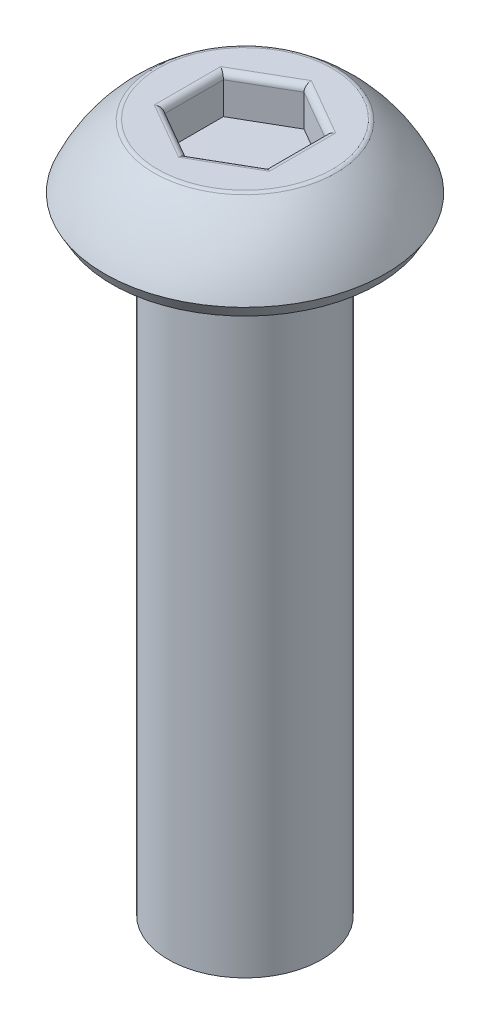
ISO-10303-21;
HEADER;
FILE_DESCRIPTION(('STEP AP214'),'2;1');
FILE_NAME('part.step','',(''),(''),'','','');
FILE_SCHEMA(('AUTOMOTIVE_DESIGN { 1 0 10303 214 1 1 1 1 }'));
ENDSEC;
DATA;
#1=APPLICATION_CONTEXT('core data for automotive mechanical design processes');
#2=APPLICATION_PROTOCOL_DEFINITION('international standard','automotive_design',2000,#1);
#3=PRODUCT_CONTEXT('',#1,'mechanical');
#4=PRODUCT('Part','Part','',(#3));
#5=PRODUCT_RELATED_PRODUCT_CATEGORY('part','',(#4));
#6=PRODUCT_DEFINITION_FORMATION('','',#4);
#7=PRODUCT_DEFINITION_CONTEXT('part definition',#1,'design');
#8=PRODUCT_DEFINITION('design','',#6,#7);
#9=PRODUCT_DEFINITION_SHAPE('','',#8);
#10=(LENGTH_UNIT() NAMED_UNIT(*) SI_UNIT(.MILLI.,.METRE.));
#11=(NAMED_UNIT(*) PLANE_ANGLE_UNIT() SI_UNIT($,.RADIAN.));
#12=(NAMED_UNIT(*) SI_UNIT($,.STERADIAN.) SOLID_ANGLE_UNIT());
#13=UNCERTAINTY_MEASURE_WITH_UNIT(LENGTH_MEASURE(1.E-05),#10,'distance_accuracy_value','');
#14=(GEOMETRIC_REPRESENTATION_CONTEXT(3) GLOBAL_UNCERTAINTY_ASSIGNED_CONTEXT((#13)) GLOBAL_UNIT_ASSIGNED_CONTEXT((#10,
#11,#12)) REPRESENTATION_CONTEXT('',''));
#15=CARTESIAN_POINT('',(0.,0.,0.));
#16=DIRECTION('',(0.,0.,1.));
#17=DIRECTION('',(1.,0.,0.));
#18=AXIS2_PLACEMENT_3D('',#15,#16,#17);
#19=CARTESIAN_POINT('',(0.,1.5,0.));
#20=DIRECTION('',(0.,-1.,0.));
#21=DIRECTION('',(0.,0.,-1.));
#22=AXIS2_PLACEMENT_3D('',#19,#20,#21);
#23=PLANE('',#22);
#24=CARTESIAN_POINT('',(0.,1.5,0.));
#25=DIRECTION('',(0.,-1.,0.));
#26=DIRECTION('',(0.,0.,-1.));
#27=AXIS2_PLACEMENT_3D('',#24,#25,#26);
#28=CIRCLE('',#27,1.70906948191647);
#29=CARTESIAN_POINT('',(0.,1.5,-1.70906948191647));
#30=VERTEX_POINT('',#29);
#31=EDGE_CURVE('E177',#30,#30,#28,.F.);
#32=ORIENTED_EDGE('',*,*,#31,.T.);
#33=EDGE_LOOP('',(#32));
#34=FACE_BOUND('',#33,.T.);
#35=DIRECTION('',(0.866025403784439,0.,-0.5));
#36=VECTOR('',#35,1.);
#37=CARTESIAN_POINT('',(0.5625,1.5,0.974278579257493));
#38=LINE('',#37,#36);
#39=CARTESIAN_POINT('',(1.125,1.5,0.649519052838329));
#40=VERTEX_POINT('',#39);
#41=CARTESIAN_POINT('',(0.,1.5,1.29903810567666));
#42=VERTEX_POINT('',#41);
#43=EDGE_CURVE('E172',#40,#42,#38,.F.);
#44=ORIENTED_EDGE('',*,*,#43,.T.);
#45=DIRECTION('',(0.866025403784439,0.,0.5));
#46=VECTOR('',#45,1.);
#47=CARTESIAN_POINT('',(-0.5625,1.5,0.974278579257493));
#48=LINE('',#47,#46);
#49=CARTESIAN_POINT('',(-1.125,1.5,0.649519052838329));
#50=VERTEX_POINT('',#49);
#51=EDGE_CURVE('E174',#42,#50,#48,.F.);
#52=ORIENTED_EDGE('',*,*,#51,.T.);
#53=DIRECTION('',(0.,0.,1.));
#54=VECTOR('',#53,1.);
#55=CARTESIAN_POINT('',(-1.125,1.5,0.));
#56=LINE('',#55,#54);
#57=CARTESIAN_POINT('',(-1.125,1.5,-0.649519052838329));
#58=VERTEX_POINT('',#57);
#59=EDGE_CURVE('E164',#50,#58,#56,.F.);
#60=ORIENTED_EDGE('',*,*,#59,.T.);
#61=DIRECTION('',(-0.866025403784439,0.,0.5));
#62=VECTOR('',#61,1.);
#63=CARTESIAN_POINT('',(-0.5625,1.5,-0.974278579257493));
#64=LINE('',#63,#62);
#65=CARTESIAN_POINT('',(0.,1.5,-1.29903810567666));
#66=VERTEX_POINT('',#65);
#67=EDGE_CURVE('E166',#58,#66,#64,.F.);
#68=ORIENTED_EDGE('',*,*,#67,.T.);
#69=DIRECTION('',(-0.866025403784439,0.,-0.5));
#70=VECTOR('',#69,1.);
#71=CARTESIAN_POINT('',(0.5625,1.5,-0.974278579257494));
#72=LINE('',#71,#70);
#73=CARTESIAN_POINT('',(1.125,1.5,-0.64951905283833));
#74=VERTEX_POINT('',#73);
#75=EDGE_CURVE('E168',#66,#74,#72,.F.);
#76=ORIENTED_EDGE('',*,*,#75,.T.);
#77=DIRECTION('',(0.,0.,-1.));
#78=VECTOR('',#77,1.);
#79=CARTESIAN_POINT('',(1.125,1.5,0.));
#80=LINE('',#79,#78);
#81=EDGE_CURVE('E170',#74,#40,#80,.F.);
#82=ORIENTED_EDGE('',*,*,#81,.T.);
#83=EDGE_LOOP('',(#44,#52,#60,#68,#76,#82));
#84=FACE_BOUND('',#83,.T.);
#85=ADVANCED_FACE('F35',(#34,#84),#23,.F.);
#86=CARTESIAN_POINT('',(0.,-0.931154789034212,0.));
#87=DIRECTION('',(0.,-1.,0.));
#88=DIRECTION('',(0.,0.,-1.));
#89=AXIS2_PLACEMENT_3D('',#86,#87,#88);
#90=DEGENERATE_TOROIDAL_SURFACE('',#89,0.00769348629276519,3.,.F.);
#91=CARTESIAN_POINT('',(0.,1.47526759952323,0.));
#92=DIRECTION('',(0.,-1.,0.));
#93=DIRECTION('',(0.,0.,-1.));
#94=AXIS2_PLACEMENT_3D('',#91,#92,#93);
#95=CIRCLE('',#94,1.78371135009948);
#96=CARTESIAN_POINT('',(0.,1.47526759952323,-1.78371135009948));
#97=VERTEX_POINT('',#96);
#98=EDGE_CURVE('E161',#97,#97,#95,.T.);
#99=ORIENTED_EDGE('',*,*,#98,.T.);
#100=EDGE_LOOP('',(#99));
#101=FACE_BOUND('',#100,.T.);
#102=CARTESIAN_POINT('',(0.,0.25,0.));
#103=DIRECTION('',(0.,-1.,0.));
#104=DIRECTION('',(0.,0.,-1.));
#105=AXIS2_PLACEMENT_3D('',#102,#103,#104);
#106=CIRCLE('',#105,2.75);
#107=CARTESIAN_POINT('',(0.,0.25,-2.75));
#108=VERTEX_POINT('',#107);
#109=EDGE_CURVE('E158',#108,#108,#106,.T.);
#110=ORIENTED_EDGE('',*,*,#109,.F.);
#111=EDGE_LOOP('',(#110));
#112=FACE_BOUND('',#111,.T.);
#113=ADVANCED_FACE('F244',(#101,#112),#90,.F.);
#114=CARTESIAN_POINT('',(0.,0.25,0.));
#115=DIRECTION('',(0.,1.,0.));
#116=DIRECTION('',(0.,0.,1.));
#117=AXIS2_PLACEMENT_3D('',#114,#115,#116);
#118=CONICAL_SURFACE('',#117,2.75,0.523598775598296);
#119=CARTESIAN_POINT('',(0.,0.,0.));
#120=DIRECTION('',(0.,-1.,0.));
#121=DIRECTION('',(0.,0.,-1.));
#122=AXIS2_PLACEMENT_3D('',#119,#120,#121);
#123=CIRCLE('',#122,2.60566243270259);
#124=CARTESIAN_POINT('',(0.,0.,-2.60566243270259));
#125=VERTEX_POINT('',#124);
#126=EDGE_CURVE('E155',#125,#125,#123,.T.);
#127=ORIENTED_EDGE('',*,*,#126,.F.);
#128=EDGE_LOOP('',(#127));
#129=FACE_BOUND('',#128,.T.);
#130=ORIENTED_EDGE('',*,*,#109,.T.);
#131=EDGE_LOOP('',(#130));
#132=FACE_BOUND('',#131,.T.);
#133=ADVANCED_FACE('F250',(#129,#132),#118,.T.);
#134=CARTESIAN_POINT('',(0.,0.,2.60566243270259));
#135=DIRECTION('',(0.,1.,0.));
#136=DIRECTION('',(0.,0.,1.));
#137=AXIS2_PLACEMENT_3D('',#134,#135,#136);
#138=PLANE('',#137);
#139=CARTESIAN_POINT('',(0.,0.,0.));
#140=DIRECTION('',(0.,-1.,0.));
#141=DIRECTION('',(0.,0.,-1.));
#142=AXIS2_PLACEMENT_3D('',#139,#140,#141);
#143=CIRCLE('',#142,1.5);
#144=CARTESIAN_POINT('',(0.,0.,-1.5));
#145=VERTEX_POINT('',#144);
#146=EDGE_CURVE('E152',#145,#145,#143,.T.);
#147=ORIENTED_EDGE('',*,*,#146,.F.);
#148=EDGE_LOOP('',(#147));
#149=FACE_BOUND('',#148,.T.);
#150=ORIENTED_EDGE('',*,*,#126,.T.);
#151=EDGE_LOOP('',(#150));
#152=FACE_BOUND('',#151,.T.);
#153=ADVANCED_FACE('F269',(#149,#152),#138,.F.);
#154=CARTESIAN_POINT('',(0.,-12.,0.));
#155=DIRECTION('',(0.,-1.,0.));
#156=DIRECTION('',(0.,0.,-1.));
#157=AXIS2_PLACEMENT_3D('',#154,#155,#156);
#158=CYLINDRICAL_SURFACE('',#157,1.5);
#159=CARTESIAN_POINT('',(0.,-12.,0.));
#160=DIRECTION('',(0.,-1.,0.));
#161=DIRECTION('',(0.,0.,-1.));
#162=AXIS2_PLACEMENT_3D('',#159,#160,#161);
#163=CIRCLE('',#162,1.5);
#164=CARTESIAN_POINT('',(0.,-12.,-1.5));
#165=VERTEX_POINT('',#164);
#166=EDGE_CURVE('E139',#165,#165,#163,.T.);
#167=ORIENTED_EDGE('',*,*,#166,.F.);
#168=EDGE_LOOP('',(#167));
#169=FACE_BOUND('',#168,.T.);
#170=ORIENTED_EDGE('',*,*,#146,.T.);
#171=EDGE_LOOP('',(#170));
#172=FACE_BOUND('',#171,.T.);
#173=ADVANCED_FACE('F274',(#169,#172),#158,.T.);
#174=CARTESIAN_POINT('',(0.,-12.,1.5));
#175=DIRECTION('',(0.,1.,0.));
#176=DIRECTION('',(0.,0.,1.));
#177=AXIS2_PLACEMENT_3D('',#174,#175,#176);
#178=PLANE('',#177);
#179=ORIENTED_EDGE('',*,*,#166,.T.);
#180=EDGE_LOOP('',(#179));
#181=FACE_BOUND('',#180,.T.);
#182=ADVANCED_FACE('F281',(#181),#178,.F.);
#183=CARTESIAN_POINT('',(0.999999999999999,0.75,-0.577350269189626));
#184=DIRECTION('',(0.5,0.,-0.866025403784439));
#185=DIRECTION('',(-0.866025403784439,0.,-0.5));
#186=AXIS2_PLACEMENT_3D('',#183,#184,#185);
#187=PLANE('',#186);
#188=DIRECTION('',(0.,1.,0.));
#189=VECTOR('',#188,1.);
#190=CARTESIAN_POINT('',(0.999999999999999,0.75,-0.577350269189626));
#191=LINE('',#190,#189);
#192=CARTESIAN_POINT('',(0.999999999999999,0.75,-0.577350269189626));
#193=VERTEX_POINT('',#192);
#194=CARTESIAN_POINT('',(0.999999999999999,1.375,-0.577350269189626));
#195=VERTEX_POINT('',#194);
#196=EDGE_CURVE('E137',#193,#195,#191,.T.);
#197=ORIENTED_EDGE('',*,*,#196,.T.);
#198=DIRECTION('',(-0.866025403784439,0.,-0.5));
#199=VECTOR('',#198,1.);
#200=CARTESIAN_POINT('',(0.999999999999999,1.375,-0.577350269189626));
#201=LINE('',#200,#199);
#202=CARTESIAN_POINT('',(0.,1.375,-1.15470053837925));
#203=VERTEX_POINT('',#202);
#204=EDGE_CURVE('E59',#195,#203,#201,.T.);
#205=ORIENTED_EDGE('',*,*,#204,.T.);
#206=DIRECTION('',(0.,1.,0.));
#207=VECTOR('',#206,1.);
#208=CARTESIAN_POINT('',(0.,0.75,-1.15470053837925));
#209=LINE('',#208,#207);
#210=CARTESIAN_POINT('',(0.,0.75,-1.15470053837925));
#211=VERTEX_POINT('',#210);
#212=EDGE_CURVE('E105',#211,#203,#209,.T.);
#213=ORIENTED_EDGE('',*,*,#212,.F.);
#214=DIRECTION('',(-0.866025403784439,0.,-0.5));
#215=VECTOR('',#214,1.);
#216=CARTESIAN_POINT('',(0.999999999999999,0.75,-0.577350269189626));
#217=LINE('',#216,#215);
#218=EDGE_CURVE('E109',#193,#211,#217,.T.);
#219=ORIENTED_EDGE('',*,*,#218,.F.);
#220=EDGE_LOOP('',(#197,#205,#213,#219));
#221=FACE_BOUND('',#220,.T.);
#222=ADVANCED_FACE('F107',(#221),#187,.F.);
#223=CARTESIAN_POINT('',(1.,0.75,0.577350269189626));
#224=DIRECTION('',(1.,0.,0.));
#225=DIRECTION('',(0.,0.,-1.));
#226=AXIS2_PLACEMENT_3D('',#223,#224,#225);
#227=PLANE('',#226);
#228=DIRECTION('',(0.,1.,0.));
#229=VECTOR('',#228,1.);
#230=CARTESIAN_POINT('',(1.,0.75,0.577350269189626));
#231=LINE('',#230,#229);
#232=CARTESIAN_POINT('',(1.,0.75,0.577350269189626));
#233=VERTEX_POINT('',#232);
#234=CARTESIAN_POINT('',(1.,1.375,0.577350269189626));
#235=VERTEX_POINT('',#234);
#236=EDGE_CURVE('E140',#233,#235,#231,.T.);
#237=ORIENTED_EDGE('',*,*,#236,.T.);
#238=DIRECTION('',(0.,0.,-1.));
#239=VECTOR('',#238,1.);
#240=CARTESIAN_POINT('',(1.,1.375,0.577350269189626));
#241=LINE('',#240,#239);
#242=EDGE_CURVE('E185',#235,#195,#241,.T.);
#243=ORIENTED_EDGE('',*,*,#242,.T.);
#244=ORIENTED_EDGE('',*,*,#196,.F.);
#245=DIRECTION('',(0.,0.,-1.));
#246=VECTOR('',#245,1.);
#247=CARTESIAN_POINT('',(1.,0.75,0.577350269189626));
#248=LINE('',#247,#246);
#249=EDGE_CURVE('E113',#233,#193,#248,.T.);
#250=ORIENTED_EDGE('',*,*,#249,.F.);
#251=EDGE_LOOP('',(#237,#243,#244,#250));
#252=FACE_BOUND('',#251,.T.);
#253=ADVANCED_FACE('F225',(#252),#227,.F.);
#254=CARTESIAN_POINT('',(0.,0.75,1.15470053837925));
#255=DIRECTION('',(0.5,0.,0.866025403784439));
#256=DIRECTION('',(0.866025403784439,0.,-0.5));
#257=AXIS2_PLACEMENT_3D('',#254,#255,#256);
#258=PLANE('',#257);
#259=DIRECTION('',(0.,1.,0.));
#260=VECTOR('',#259,1.);
#261=CARTESIAN_POINT('',(0.,0.75,1.15470053837925));
#262=LINE('',#261,#260);
#263=CARTESIAN_POINT('',(0.,0.75,1.15470053837925));
#264=VERTEX_POINT('',#263);
#265=CARTESIAN_POINT('',(0.,1.375,1.15470053837925));
#266=VERTEX_POINT('',#265);
#267=EDGE_CURVE('E143',#264,#266,#262,.T.);
#268=ORIENTED_EDGE('',*,*,#267,.T.);
#269=DIRECTION('',(0.866025403784439,0.,-0.5));
#270=VECTOR('',#269,1.);
#271=CARTESIAN_POINT('',(0.,1.375,1.15470053837925));
#272=LINE('',#271,#270);
#273=EDGE_CURVE('E183',#266,#235,#272,.T.);
#274=ORIENTED_EDGE('',*,*,#273,.T.);
#275=ORIENTED_EDGE('',*,*,#236,.F.);
#276=DIRECTION('',(0.866025403784439,0.,-0.5));
#277=VECTOR('',#276,1.);
#278=CARTESIAN_POINT('',(0.,0.75,1.15470053837925));
#279=LINE('',#278,#277);
#280=EDGE_CURVE('E134',#264,#233,#279,.T.);
#281=ORIENTED_EDGE('',*,*,#280,.F.);
#282=EDGE_LOOP('',(#268,#274,#275,#281));
#283=FACE_BOUND('',#282,.T.);
#284=ADVANCED_FACE('F226',(#283),#258,.F.);
#285=CARTESIAN_POINT('',(-0.999999999999999,0.75,0.577350269189626));
#286=DIRECTION('',(-0.5,0.,0.866025403784439));
#287=DIRECTION('',(0.866025403784439,0.,0.5));
#288=AXIS2_PLACEMENT_3D('',#285,#286,#287);
#289=PLANE('',#288);
#290=DIRECTION('',(0.,1.,0.));
#291=VECTOR('',#290,1.);
#292=CARTESIAN_POINT('',(-0.999999999999999,0.75,0.577350269189626));
#293=LINE('',#292,#291);
#294=CARTESIAN_POINT('',(-0.999999999999999,0.75,0.577350269189626));
#295=VERTEX_POINT('',#294);
#296=CARTESIAN_POINT('',(-0.999999999999999,1.375,0.577350269189626));
#297=VERTEX_POINT('',#296);
#298=EDGE_CURVE('E146',#295,#297,#293,.T.);
#299=ORIENTED_EDGE('',*,*,#298,.T.);
#300=DIRECTION('',(0.866025403784439,0.,0.5));
#301=VECTOR('',#300,1.);
#302=CARTESIAN_POINT('',(-0.999999999999999,1.375,0.577350269189626));
#303=LINE('',#302,#301);
#304=EDGE_CURVE('E180',#297,#266,#303,.T.);
#305=ORIENTED_EDGE('',*,*,#304,.T.);
#306=ORIENTED_EDGE('',*,*,#267,.F.);
#307=DIRECTION('',(0.866025403784439,0.,0.5));
#308=VECTOR('',#307,1.);
#309=CARTESIAN_POINT('',(-0.999999999999999,0.75,0.577350269189626));
#310=LINE('',#309,#308);
#311=EDGE_CURVE('E131',#295,#264,#310,.T.);
#312=ORIENTED_EDGE('',*,*,#311,.F.);
#313=EDGE_LOOP('',(#299,#305,#306,#312));
#314=FACE_BOUND('',#313,.T.);
#315=ADVANCED_FACE('F221',(#314),#289,.F.);
#316=CARTESIAN_POINT('',(-1.,0.75,-0.577350269189626));
#317=DIRECTION('',(-1.,0.,0.));
#318=DIRECTION('',(0.,0.,1.));
#319=AXIS2_PLACEMENT_3D('',#316,#317,#318);
#320=PLANE('',#319);
#321=DIRECTION('',(0.,1.,0.));
#322=VECTOR('',#321,1.);
#323=CARTESIAN_POINT('',(-1.,0.75,-0.577350269189626));
#324=LINE('',#323,#322);
#325=CARTESIAN_POINT('',(-1.,0.75,-0.577350269189626));
#326=VERTEX_POINT('',#325);
#327=CARTESIAN_POINT('',(-1.,1.375,-0.577350269189626));
#328=VERTEX_POINT('',#327);
#329=EDGE_CURVE('E112',#326,#328,#324,.T.);
#330=ORIENTED_EDGE('',*,*,#329,.T.);
#331=DIRECTION('',(0.,0.,1.));
#332=VECTOR('',#331,1.);
#333=CARTESIAN_POINT('',(-1.,1.375,-0.577350269189626));
#334=LINE('',#333,#332);
#335=EDGE_CURVE('E11',#328,#297,#334,.T.);
#336=ORIENTED_EDGE('',*,*,#335,.T.);
#337=ORIENTED_EDGE('',*,*,#298,.F.);
#338=DIRECTION('',(0.,0.,1.));
#339=VECTOR('',#338,1.);
#340=CARTESIAN_POINT('',(-1.,0.75,-0.577350269189626));
#341=LINE('',#340,#339);
#342=EDGE_CURVE('E121',#326,#295,#341,.T.);
#343=ORIENTED_EDGE('',*,*,#342,.F.);
#344=EDGE_LOOP('',(#330,#336,#337,#343));
#345=FACE_BOUND('',#344,.T.);
#346=ADVANCED_FACE('F218',(#345),#320,.F.);
#347=CARTESIAN_POINT('',(0.,0.75,-1.15470053837925));
#348=DIRECTION('',(-0.5,0.,-0.866025403784438));
#349=DIRECTION('',(-0.866025403784439,0.,0.5));
#350=AXIS2_PLACEMENT_3D('',#347,#348,#349);
#351=PLANE('',#350);
#352=ORIENTED_EDGE('',*,*,#212,.T.);
#353=DIRECTION('',(-0.866025403784439,0.,0.5));
#354=VECTOR('',#353,1.);
#355=CARTESIAN_POINT('',(0.,1.375,-1.15470053837925));
#356=LINE('',#355,#354);
#357=EDGE_CURVE('E44',#203,#328,#356,.T.);
#358=ORIENTED_EDGE('',*,*,#357,.T.);
#359=ORIENTED_EDGE('',*,*,#329,.F.);
#360=DIRECTION('',(-0.866025403784439,0.,0.5));
#361=VECTOR('',#360,1.);
#362=CARTESIAN_POINT('',(0.,0.75,-1.15470053837925));
#363=LINE('',#362,#361);
#364=EDGE_CURVE('E116',#211,#326,#363,.T.);
#365=ORIENTED_EDGE('',*,*,#364,.F.);
#366=EDGE_LOOP('',(#352,#358,#359,#365));
#367=FACE_BOUND('',#366,.T.);
#368=ADVANCED_FACE('F117',(#367),#351,.F.);
#369=CARTESIAN_POINT('',(0.,0.75,0.));
#370=DIRECTION('',(0.,1.,0.));
#371=DIRECTION('',(0.,0.,1.));
#372=AXIS2_PLACEMENT_3D('',#369,#370,#371);
#373=PLANE('',#372);
#374=ORIENTED_EDGE('',*,*,#218,.T.);
#375=ORIENTED_EDGE('',*,*,#364,.T.);
#376=ORIENTED_EDGE('',*,*,#342,.T.);
#377=ORIENTED_EDGE('',*,*,#311,.T.);
#378=ORIENTED_EDGE('',*,*,#280,.T.);
#379=ORIENTED_EDGE('',*,*,#249,.T.);
#380=EDGE_LOOP('',(#374,#375,#376,#377,#378,#379));
#381=FACE_BOUND('',#380,.T.);
#382=ADVANCED_FACE('F123',(#381),#373,.T.);
#383=CARTESIAN_POINT('',(0.,1.375,0.));
#384=DIRECTION('',(0.,-1.,0.));
#385=DIRECTION('',(0.,0.,-1.));
#386=AXIS2_PLACEMENT_3D('',#383,#384,#385);
#387=TOROIDAL_SURFACE('',#386,1.70906948191647,0.125);
#388=ORIENTED_EDGE('',*,*,#31,.F.);
#389=EDGE_LOOP('',(#388));
#390=FACE_BOUND('',#389,.T.);
#391=ORIENTED_EDGE('',*,*,#98,.F.);
#392=EDGE_LOOP('',(#391));
#393=FACE_BOUND('',#392,.T.);
#394=ADVANCED_FACE('F254',(#390,#393),#387,.T.);
#395=CARTESIAN_POINT('',(1.0625,1.375,-0.685603444662681));
#396=DIRECTION('',(-0.866025403784439,0.,-0.5));
#397=DIRECTION('',(-0.5,0.,0.866025403784439));
#398=AXIS2_PLACEMENT_3D('',#395,#396,#397);
#399=CYLINDRICAL_SURFACE('',#398,0.125);
#400=CARTESIAN_POINT('',(1.125,1.375,-0.64951905283833));
#401=DIRECTION('',(-0.5,0.,-0.866025403784438));
#402=DIRECTION('',(0.866025403784439,0.,-0.5));
#403=AXIS2_PLACEMENT_3D('',#400,#401,#402);
#404=ELLIPSE('',#403,0.144337567297406,0.125);
#405=EDGE_CURVE('E128',#74,#195,#404,.F.);
#406=ORIENTED_EDGE('',*,*,#405,.F.);
#407=ORIENTED_EDGE('',*,*,#75,.F.);
#408=CARTESIAN_POINT('',(0.,1.375,-1.29903810567666));
#409=DIRECTION('',(-1.,0.,0.));
#410=DIRECTION('',(0.,0.,-1.));
#411=AXIS2_PLACEMENT_3D('',#408,#409,#410);
#412=ELLIPSE('',#411,0.144337567297406,0.125);
#413=EDGE_CURVE('E39',#203,#66,#412,.T.);
#414=ORIENTED_EDGE('',*,*,#413,.F.);
#415=ORIENTED_EDGE('',*,*,#204,.F.);
#416=EDGE_LOOP('',(#406,#407,#414,#415));
#417=FACE_BOUND('',#416,.T.);
#418=ADVANCED_FACE('F37',(#417),#399,.T.);
#419=CARTESIAN_POINT('',(-0.0625000000000002,1.375,-1.26295371385231));
#420=DIRECTION('',(-0.866025403784439,0.,0.5));
#421=DIRECTION('',(0.5,0.,0.866025403784439));
#422=AXIS2_PLACEMENT_3D('',#419,#420,#421);
#423=CYLINDRICAL_SURFACE('',#422,0.125);
#424=ORIENTED_EDGE('',*,*,#413,.T.);
#425=ORIENTED_EDGE('',*,*,#67,.F.);
#426=CARTESIAN_POINT('',(-1.125,1.375,-0.649519052838329));
#427=DIRECTION('',(-0.5,0.,0.866025403784439));
#428=DIRECTION('',(-0.866025403784439,0.,-0.5));
#429=AXIS2_PLACEMENT_3D('',#426,#427,#428);
#430=ELLIPSE('',#429,0.144337567297406,0.125);
#431=EDGE_CURVE('E196',#328,#58,#430,.T.);
#432=ORIENTED_EDGE('',*,*,#431,.F.);
#433=ORIENTED_EDGE('',*,*,#357,.F.);
#434=EDGE_LOOP('',(#424,#425,#432,#433));
#435=FACE_BOUND('',#434,.T.);
#436=ADVANCED_FACE('F210',(#435),#423,.T.);
#437=CARTESIAN_POINT('',(1.125,1.375,0.577350269189626));
#438=DIRECTION('',(0.,0.,-1.));
#439=DIRECTION('',(-1.,0.,0.));
#440=AXIS2_PLACEMENT_3D('',#437,#438,#439);
#441=CYLINDRICAL_SURFACE('',#440,0.125);
#442=ORIENTED_EDGE('',*,*,#405,.T.);
#443=ORIENTED_EDGE('',*,*,#242,.F.);
#444=CARTESIAN_POINT('',(1.125,1.375,0.649519052838329));
#445=DIRECTION('',(0.5,0.,-0.866025403784439));
#446=DIRECTION('',(0.866025403784439,0.,0.5));
#447=AXIS2_PLACEMENT_3D('',#444,#445,#446);
#448=ELLIPSE('',#447,0.144337567297406,0.125);
#449=EDGE_CURVE('E193',#40,#235,#448,.F.);
#450=ORIENTED_EDGE('',*,*,#449,.F.);
#451=ORIENTED_EDGE('',*,*,#81,.F.);
#452=EDGE_LOOP('',(#442,#443,#450,#451));
#453=FACE_BOUND('',#452,.T.);
#454=ADVANCED_FACE('F203',(#453),#441,.T.);
#455=CARTESIAN_POINT('',(-1.125,1.375,-0.577350269189626));
#456=DIRECTION('',(0.,0.,1.));
#457=DIRECTION('',(1.,0.,0.));
#458=AXIS2_PLACEMENT_3D('',#455,#456,#457);
#459=CYLINDRICAL_SURFACE('',#458,0.125);
#460=ORIENTED_EDGE('',*,*,#431,.T.);
#461=ORIENTED_EDGE('',*,*,#59,.F.);
#462=CARTESIAN_POINT('',(-1.125,1.375,0.649519052838329));
#463=DIRECTION('',(0.5,0.,0.866025403784438));
#464=DIRECTION('',(0.866025403784439,0.,-0.5));
#465=AXIS2_PLACEMENT_3D('',#462,#463,#464);
#466=ELLIPSE('',#465,0.144337567297406,0.125);
#467=EDGE_CURVE('E191',#297,#50,#466,.T.);
#468=ORIENTED_EDGE('',*,*,#467,.F.);
#469=ORIENTED_EDGE('',*,*,#335,.F.);
#470=EDGE_LOOP('',(#460,#461,#468,#469));
#471=FACE_BOUND('',#470,.T.);
#472=ADVANCED_FACE('F215',(#471),#459,.T.);
#473=CARTESIAN_POINT('',(0.0625000000000004,1.375,1.26295371385231));
#474=DIRECTION('',(0.866025403784439,0.,-0.5));
#475=DIRECTION('',(-0.5,0.,-0.866025403784439));
#476=AXIS2_PLACEMENT_3D('',#473,#474,#475);
#477=CYLINDRICAL_SURFACE('',#476,0.125);
#478=ORIENTED_EDGE('',*,*,#449,.T.);
#479=ORIENTED_EDGE('',*,*,#273,.F.);
#480=CARTESIAN_POINT('',(0.,1.375,1.29903810567666));
#481=DIRECTION('',(1.,0.,0.));
#482=DIRECTION('',(0.,0.,1.));
#483=AXIS2_PLACEMENT_3D('',#480,#481,#482);
#484=ELLIPSE('',#483,0.144337567297406,0.125);
#485=EDGE_CURVE('E189',#42,#266,#484,.F.);
#486=ORIENTED_EDGE('',*,*,#485,.F.);
#487=ORIENTED_EDGE('',*,*,#43,.F.);
#488=EDGE_LOOP('',(#478,#479,#486,#487));
#489=FACE_BOUND('',#488,.T.);
#490=ADVANCED_FACE('F230',(#489),#477,.T.);
#491=CARTESIAN_POINT('',(-1.0625,1.375,0.685603444662681));
#492=DIRECTION('',(0.866025403784439,0.,0.5));
#493=DIRECTION('',(0.5,0.,-0.866025403784439));
#494=AXIS2_PLACEMENT_3D('',#491,#492,#493);
#495=CYLINDRICAL_SURFACE('',#494,0.125);
#496=ORIENTED_EDGE('',*,*,#467,.T.);
#497=ORIENTED_EDGE('',*,*,#51,.F.);
#498=ORIENTED_EDGE('',*,*,#485,.T.);
#499=ORIENTED_EDGE('',*,*,#304,.F.);
#500=EDGE_LOOP('',(#496,#497,#498,#499));
#501=FACE_BOUND('',#500,.T.);
#502=ADVANCED_FACE('F235',(#501),#495,.T.);
#503=CLOSED_SHELL('',(#85,#113,#133,#153,#173,#182,#222,#253,#284,#315,#346,#368,#382,#394,#418,
#436,#454,#472,#490,#502));
#504=MANIFOLD_SOLID_BREP('B2',#503);
#505=ADVANCED_BREP_SHAPE_REPRESENTATION('',(#18,#504),#14);
#506=SHAPE_DEFINITION_REPRESENTATION(#9,#505);
ENDSEC;
END-ISO-10303-21;
